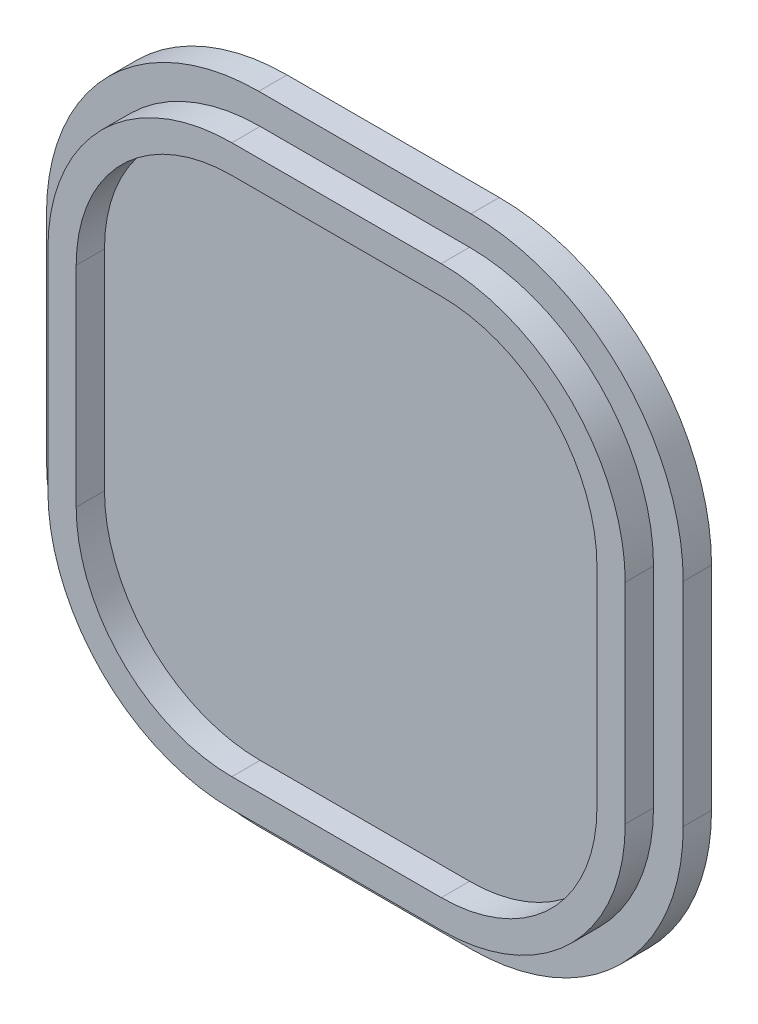
ISO-10303-21;
HEADER;
FILE_DESCRIPTION(('STEP AP214'),'2;1');
FILE_NAME('part.step','',(''),(''),'','','');
FILE_SCHEMA(('AUTOMOTIVE_DESIGN { 1 0 10303 214 1 1 1 1 }'));
ENDSEC;
DATA;
#1=APPLICATION_CONTEXT('core data for automotive mechanical design processes');
#2=APPLICATION_PROTOCOL_DEFINITION('international standard','automotive_design',2000,#1);
#3=PRODUCT_CONTEXT('',#1,'mechanical');
#4=PRODUCT('Part','Part','',(#3));
#5=PRODUCT_RELATED_PRODUCT_CATEGORY('part','',(#4));
#6=PRODUCT_DEFINITION_FORMATION('','',#4);
#7=PRODUCT_DEFINITION_CONTEXT('part definition',#1,'design');
#8=PRODUCT_DEFINITION('design','',#6,#7);
#9=PRODUCT_DEFINITION_SHAPE('','',#8);
#10=(LENGTH_UNIT() NAMED_UNIT(*) SI_UNIT(.MILLI.,.METRE.));
#11=(NAMED_UNIT(*) PLANE_ANGLE_UNIT() SI_UNIT($,.RADIAN.));
#12=(NAMED_UNIT(*) SI_UNIT($,.STERADIAN.) SOLID_ANGLE_UNIT());
#13=UNCERTAINTY_MEASURE_WITH_UNIT(LENGTH_MEASURE(1.E-05),#10,'distance_accuracy_value','');
#14=(GEOMETRIC_REPRESENTATION_CONTEXT(3) GLOBAL_UNCERTAINTY_ASSIGNED_CONTEXT((#13)) GLOBAL_UNIT_ASSIGNED_CONTEXT((#10,
#11,#12)) REPRESENTATION_CONTEXT('',''));
#15=CARTESIAN_POINT('',(0.,0.,0.));
#16=DIRECTION('',(0.,0.,1.));
#17=DIRECTION('',(1.,0.,0.));
#18=AXIS2_PLACEMENT_3D('',#15,#16,#17);
#19=CARTESIAN_POINT('',(0.,0.,2.));
#20=DIRECTION('',(0.,0.,1.));
#21=DIRECTION('',(1.,0.,0.));
#22=AXIS2_PLACEMENT_3D('',#19,#20,#21);
#23=PLANE('',#22);
#24=CARTESIAN_POINT('',(18.7797662481044,3.40317919075145,2.));
#25=DIRECTION('',(0.,0.,1.));
#26=DIRECTION('',(1.,0.,0.));
#27=AXIS2_PLACEMENT_3D('',#24,#25,#26);
#28=CIRCLE('',#27,15.);
#29=CARTESIAN_POINT('',(33.7797662481044,3.40317919075145,2.));
#30=VERTEX_POINT('',#29);
#31=CARTESIAN_POINT('',(18.7797662481044,18.4031791907514,2.));
#32=VERTEX_POINT('',#31);
#33=EDGE_CURVE('E334',#30,#32,#28,.T.);
#34=ORIENTED_EDGE('',*,*,#33,.T.);
#35=DIRECTION('',(-1.,0.,0.));
#36=VECTOR('',#35,1.);
#37=CARTESIAN_POINT('',(-11.2202337518956,18.4031791907514,2.));
#38=LINE('',#37,#36);
#39=CARTESIAN_POINT('',(3.77976624810443,18.4031791907514,2.));
#40=VERTEX_POINT('',#39);
#41=EDGE_CURVE('E303',#32,#40,#38,.T.);
#42=ORIENTED_EDGE('',*,*,#41,.T.);
#43=CARTESIAN_POINT('',(3.77976624810444,3.40317919075145,2.));
#44=DIRECTION('',(0.,0.,1.));
#45=DIRECTION('',(1.,0.,0.));
#46=AXIS2_PLACEMENT_3D('',#43,#44,#45);
#47=CIRCLE('',#46,15.);
#48=CARTESIAN_POINT('',(-11.2202337518956,3.40317919075145,2.));
#49=VERTEX_POINT('',#48);
#50=EDGE_CURVE('E336',#40,#49,#47,.T.);
#51=ORIENTED_EDGE('',*,*,#50,.T.);
#52=DIRECTION('',(0.,-1.,0.));
#53=VECTOR('',#52,1.);
#54=CARTESIAN_POINT('',(-11.2202337518956,18.4031791907514,2.));
#55=LINE('',#54,#53);
#56=CARTESIAN_POINT('',(-11.2202337518956,-11.5968208092485,2.));
#57=VERTEX_POINT('',#56);
#58=EDGE_CURVE('E293',#49,#57,#55,.T.);
#59=ORIENTED_EDGE('',*,*,#58,.T.);
#60=CARTESIAN_POINT('',(3.77976624810444,-11.5968208092486,2.));
#61=DIRECTION('',(0.,0.,1.));
#62=DIRECTION('',(1.,0.,0.));
#63=AXIS2_PLACEMENT_3D('',#60,#61,#62);
#64=CIRCLE('',#63,15.);
#65=CARTESIAN_POINT('',(3.77976624810444,-26.5968208092486,2.));
#66=VERTEX_POINT('',#65);
#67=EDGE_CURVE('E338',#57,#66,#64,.T.);
#68=ORIENTED_EDGE('',*,*,#67,.T.);
#69=DIRECTION('',(1.,0.,0.));
#70=VECTOR('',#69,1.);
#71=CARTESIAN_POINT('',(-11.2202337518956,-26.5968208092486,2.));
#72=LINE('',#71,#70);
#73=CARTESIAN_POINT('',(18.7797662481044,-26.5968208092486,2.));
#74=VERTEX_POINT('',#73);
#75=EDGE_CURVE('E296',#66,#74,#72,.T.);
#76=ORIENTED_EDGE('',*,*,#75,.T.);
#77=CARTESIAN_POINT('',(18.7797662481044,-11.5968208092486,2.));
#78=DIRECTION('',(0.,0.,1.));
#79=DIRECTION('',(1.,0.,0.));
#80=AXIS2_PLACEMENT_3D('',#77,#78,#79);
#81=CIRCLE('',#80,15.);
#82=CARTESIAN_POINT('',(33.7797662481044,-11.5968208092485,2.));
#83=VERTEX_POINT('',#82);
#84=EDGE_CURVE('E340',#74,#83,#81,.T.);
#85=ORIENTED_EDGE('',*,*,#84,.T.);
#86=DIRECTION('',(0.,1.,0.));
#87=VECTOR('',#86,1.);
#88=CARTESIAN_POINT('',(33.7797662481044,18.4031791907514,2.));
#89=LINE('',#88,#87);
#90=EDGE_CURVE('E300',#83,#30,#89,.T.);
#91=ORIENTED_EDGE('',*,*,#90,.T.);
#92=EDGE_LOOP('',(#34,#42,#51,#59,#68,#76,#85,#91));
#93=FACE_BOUND('',#92,.T.);
#94=DIRECTION('',(0.,1.,0.));
#95=VECTOR('',#94,1.);
#96=CARTESIAN_POINT('',(31.6797662481044,16.3031791907514,2.));
#97=LINE('',#96,#95);
#98=CARTESIAN_POINT('',(31.6797662481044,-11.4968208092486,2.));
#99=VERTEX_POINT('',#98);
#100=CARTESIAN_POINT('',(31.6797662481044,3.30317919075144,2.));
#101=VERTEX_POINT('',#100);
#102=EDGE_CURVE('E281',#99,#101,#97,.T.);
#103=ORIENTED_EDGE('',*,*,#102,.F.);
#104=CARTESIAN_POINT('',(18.6797662481044,-11.4968208092486,2.));
#105=DIRECTION('',(0.,0.,1.));
#106=DIRECTION('',(1.,0.,0.));
#107=AXIS2_PLACEMENT_3D('',#104,#105,#106);
#108=CIRCLE('',#107,13.);
#109=CARTESIAN_POINT('',(18.6797662481044,-24.4968208092486,2.));
#110=VERTEX_POINT('',#109);
#111=EDGE_CURVE('E376',#99,#110,#108,.F.);
#112=ORIENTED_EDGE('',*,*,#111,.T.);
#113=DIRECTION('',(1.,0.,0.));
#114=VECTOR('',#113,1.);
#115=CARTESIAN_POINT('',(-9.12023375189556,-24.4968208092486,2.));
#116=LINE('',#115,#114);
#117=CARTESIAN_POINT('',(3.87976624810444,-24.4968208092486,2.));
#118=VERTEX_POINT('',#117);
#119=EDGE_CURVE('E285',#118,#110,#116,.T.);
#120=ORIENTED_EDGE('',*,*,#119,.F.);
#121=CARTESIAN_POINT('',(3.87976624810444,-11.4968208092486,2.));
#122=DIRECTION('',(0.,0.,1.));
#123=DIRECTION('',(1.,0.,0.));
#124=AXIS2_PLACEMENT_3D('',#121,#122,#123);
#125=CIRCLE('',#124,13.);
#126=CARTESIAN_POINT('',(-9.12023375189556,-11.4968208092486,2.));
#127=VERTEX_POINT('',#126);
#128=EDGE_CURVE('E378',#118,#127,#125,.F.);
#129=ORIENTED_EDGE('',*,*,#128,.T.);
#130=DIRECTION('',(0.,-1.,0.));
#131=VECTOR('',#130,1.);
#132=CARTESIAN_POINT('',(-9.12023375189556,16.3031791907514,2.));
#133=LINE('',#132,#131);
#134=CARTESIAN_POINT('',(-9.12023375189556,3.30317919075144,2.));
#135=VERTEX_POINT('',#134);
#136=EDGE_CURVE('E288',#135,#127,#133,.T.);
#137=ORIENTED_EDGE('',*,*,#136,.F.);
#138=CARTESIAN_POINT('',(3.87976624810444,3.30317919075144,2.));
#139=DIRECTION('',(0.,0.,1.));
#140=DIRECTION('',(1.,0.,0.));
#141=AXIS2_PLACEMENT_3D('',#138,#139,#140);
#142=CIRCLE('',#141,13.);
#143=CARTESIAN_POINT('',(3.87976624810444,16.3031791907514,2.));
#144=VERTEX_POINT('',#143);
#145=EDGE_CURVE('E41',#135,#144,#142,.F.);
#146=ORIENTED_EDGE('',*,*,#145,.T.);
#147=DIRECTION('',(-1.,0.,0.));
#148=VECTOR('',#147,1.);
#149=CARTESIAN_POINT('',(-9.12023375189556,16.3031791907514,2.));
#150=LINE('',#149,#148);
#151=CARTESIAN_POINT('',(18.6797662481044,16.3031791907514,2.));
#152=VERTEX_POINT('',#151);
#153=EDGE_CURVE('E286',#152,#144,#150,.T.);
#154=ORIENTED_EDGE('',*,*,#153,.F.);
#155=CARTESIAN_POINT('',(18.6797662481044,3.30317919075144,2.));
#156=DIRECTION('',(0.,0.,1.));
#157=DIRECTION('',(1.,0.,0.));
#158=AXIS2_PLACEMENT_3D('',#155,#156,#157);
#159=CIRCLE('',#158,13.);
#160=EDGE_CURVE('E11',#152,#101,#159,.F.);
#161=ORIENTED_EDGE('',*,*,#160,.T.);
#162=EDGE_LOOP('',(#103,#112,#120,#129,#137,#146,#154,#161));
#163=FACE_BOUND('',#162,.T.);
#164=ADVANCED_FACE('F33',(#93,#163),#23,.T.);
#165=CARTESIAN_POINT('',(-11.2202337518956,18.4031791907514,2.));
#166=DIRECTION('',(1.,0.,0.));
#167=DIRECTION('',(0.,1.,0.));
#168=AXIS2_PLACEMENT_3D('',#165,#166,#167);
#169=PLANE('',#168);
#170=DIRECTION('',(0.,-1.,0.));
#171=VECTOR('',#170,1.);
#172=CARTESIAN_POINT('',(-11.2202337518956,18.4031791907514,0.));
#173=LINE('',#172,#171);
#174=CARTESIAN_POINT('',(-11.2202337518956,3.40317919075145,0.));
#175=VERTEX_POINT('',#174);
#176=CARTESIAN_POINT('',(-11.2202337518956,-11.5968208092485,0.));
#177=VERTEX_POINT('',#176);
#178=EDGE_CURVE('E280',#175,#177,#173,.T.);
#179=ORIENTED_EDGE('',*,*,#178,.T.);
#180=DIRECTION('',(0.,0.,-1.));
#181=VECTOR('',#180,1.);
#182=CARTESIAN_POINT('',(-11.2202337518956,-11.5968208092486,2.));
#183=LINE('',#182,#181);
#184=EDGE_CURVE('E345',#177,#57,#183,.F.);
#185=ORIENTED_EDGE('',*,*,#184,.T.);
#186=ORIENTED_EDGE('',*,*,#58,.F.);
#187=DIRECTION('',(0.,0.,-1.));
#188=VECTOR('',#187,1.);
#189=CARTESIAN_POINT('',(-11.2202337518956,3.40317919075144,2.));
#190=LINE('',#189,#188);
#191=EDGE_CURVE('E342',#49,#175,#190,.T.);
#192=ORIENTED_EDGE('',*,*,#191,.T.);
#193=EDGE_LOOP('',(#179,#185,#186,#192));
#194=FACE_BOUND('',#193,.T.);
#195=ADVANCED_FACE('F414',(#194),#169,.F.);
#196=CARTESIAN_POINT('',(-11.2202337518956,-26.5968208092486,2.));
#197=DIRECTION('',(0.,1.,0.));
#198=DIRECTION('',(0.,0.,1.));
#199=AXIS2_PLACEMENT_3D('',#196,#197,#198);
#200=PLANE('',#199);
#201=DIRECTION('',(1.,0.,0.));
#202=VECTOR('',#201,1.);
#203=CARTESIAN_POINT('',(-11.2202337518956,-26.5968208092486,0.));
#204=LINE('',#203,#202);
#205=CARTESIAN_POINT('',(3.77976624810444,-26.5968208092486,0.));
#206=VERTEX_POINT('',#205);
#207=CARTESIAN_POINT('',(18.7797662481044,-26.5968208092486,0.));
#208=VERTEX_POINT('',#207);
#209=EDGE_CURVE('E309',#206,#208,#204,.T.);
#210=ORIENTED_EDGE('',*,*,#209,.T.);
#211=DIRECTION('',(0.,0.,-1.));
#212=VECTOR('',#211,1.);
#213=CARTESIAN_POINT('',(18.7797662481044,-26.5968208092486,2.));
#214=LINE('',#213,#212);
#215=EDGE_CURVE('E332',#208,#74,#214,.F.);
#216=ORIENTED_EDGE('',*,*,#215,.T.);
#217=ORIENTED_EDGE('',*,*,#75,.F.);
#218=DIRECTION('',(0.,0.,-1.));
#219=VECTOR('',#218,1.);
#220=CARTESIAN_POINT('',(3.77976624810444,-26.5968208092486,2.));
#221=LINE('',#220,#219);
#222=EDGE_CURVE('E329',#66,#206,#221,.T.);
#223=ORIENTED_EDGE('',*,*,#222,.T.);
#224=EDGE_LOOP('',(#210,#216,#217,#223));
#225=FACE_BOUND('',#224,.T.);
#226=ADVANCED_FACE('F420',(#225),#200,.F.);
#227=CARTESIAN_POINT('',(33.7797662481044,18.4031791907514,2.));
#228=DIRECTION('',(-1.,0.,0.));
#229=DIRECTION('',(0.,0.,1.));
#230=AXIS2_PLACEMENT_3D('',#227,#228,#229);
#231=PLANE('',#230);
#232=ORIENTED_EDGE('',*,*,#90,.F.);
#233=DIRECTION('',(0.,0.,-1.));
#234=VECTOR('',#233,1.);
#235=CARTESIAN_POINT('',(33.7797662481044,-11.5968208092486,2.));
#236=LINE('',#235,#234);
#237=CARTESIAN_POINT('',(33.7797662481044,-11.5968208092485,0.));
#238=VERTEX_POINT('',#237);
#239=EDGE_CURVE('E318',#83,#238,#236,.T.);
#240=ORIENTED_EDGE('',*,*,#239,.T.);
#241=DIRECTION('',(0.,1.,0.));
#242=VECTOR('',#241,1.);
#243=CARTESIAN_POINT('',(33.7797662481044,18.4031791907514,0.));
#244=LINE('',#243,#242);
#245=CARTESIAN_POINT('',(33.7797662481044,3.40317919075145,0.));
#246=VERTEX_POINT('',#245);
#247=EDGE_CURVE('E312',#238,#246,#244,.T.);
#248=ORIENTED_EDGE('',*,*,#247,.T.);
#249=DIRECTION('',(0.,0.,-1.));
#250=VECTOR('',#249,1.);
#251=CARTESIAN_POINT('',(33.7797662481044,3.40317919075145,2.));
#252=LINE('',#251,#250);
#253=EDGE_CURVE('E306',#246,#30,#252,.F.);
#254=ORIENTED_EDGE('',*,*,#253,.T.);
#255=EDGE_LOOP('',(#232,#240,#248,#254));
#256=FACE_BOUND('',#255,.T.);
#257=ADVANCED_FACE('F434',(#256),#231,.F.);
#258=CARTESIAN_POINT('',(-11.2202337518956,18.4031791907514,2.));
#259=DIRECTION('',(0.,-1.,0.));
#260=DIRECTION('',(0.,0.,-1.));
#261=AXIS2_PLACEMENT_3D('',#258,#259,#260);
#262=PLANE('',#261);
#263=DIRECTION('',(-1.,0.,0.));
#264=VECTOR('',#263,1.);
#265=CARTESIAN_POINT('',(-11.2202337518956,18.4031791907514,0.));
#266=LINE('',#265,#264);
#267=CARTESIAN_POINT('',(18.7797662481044,18.4031791907514,0.));
#268=VERTEX_POINT('',#267);
#269=CARTESIAN_POINT('',(3.77976624810443,18.4031791907514,0.));
#270=VERTEX_POINT('',#269);
#271=EDGE_CURVE('E297',#268,#270,#266,.T.);
#272=ORIENTED_EDGE('',*,*,#271,.T.);
#273=DIRECTION('',(0.,0.,-1.));
#274=VECTOR('',#273,1.);
#275=CARTESIAN_POINT('',(3.77976624810444,18.4031791907514,2.));
#276=LINE('',#275,#274);
#277=EDGE_CURVE('E289',#270,#40,#276,.F.);
#278=ORIENTED_EDGE('',*,*,#277,.T.);
#279=ORIENTED_EDGE('',*,*,#41,.F.);
#280=DIRECTION('',(0.,0.,-1.));
#281=VECTOR('',#280,1.);
#282=CARTESIAN_POINT('',(18.7797662481044,18.4031791907514,2.));
#283=LINE('',#282,#281);
#284=EDGE_CURVE('E347',#32,#268,#283,.T.);
#285=ORIENTED_EDGE('',*,*,#284,.T.);
#286=EDGE_LOOP('',(#272,#278,#279,#285));
#287=FACE_BOUND('',#286,.T.);
#288=ADVANCED_FACE('F430',(#287),#262,.F.);
#289=CARTESIAN_POINT('',(0.,0.,0.));
#290=DIRECTION('',(0.,0.,1.));
#291=DIRECTION('',(1.,0.,0.));
#292=AXIS2_PLACEMENT_3D('',#289,#290,#291);
#293=PLANE('',#292);
#294=ORIENTED_EDGE('',*,*,#247,.F.);
#295=CARTESIAN_POINT('',(18.7797662481044,-11.5968208092486,0.));
#296=DIRECTION('',(0.,0.,1.));
#297=DIRECTION('',(1.,0.,0.));
#298=AXIS2_PLACEMENT_3D('',#295,#296,#297);
#299=CIRCLE('',#298,15.);
#300=EDGE_CURVE('E327',#238,#208,#299,.F.);
#301=ORIENTED_EDGE('',*,*,#300,.T.);
#302=ORIENTED_EDGE('',*,*,#209,.F.);
#303=CARTESIAN_POINT('',(3.77976624810444,-11.5968208092486,0.));
#304=DIRECTION('',(0.,0.,1.));
#305=DIRECTION('',(1.,0.,0.));
#306=AXIS2_PLACEMENT_3D('',#303,#304,#305);
#307=CIRCLE('',#306,15.);
#308=EDGE_CURVE('E325',#206,#177,#307,.F.);
#309=ORIENTED_EDGE('',*,*,#308,.T.);
#310=ORIENTED_EDGE('',*,*,#178,.F.);
#311=CARTESIAN_POINT('',(3.77976624810444,3.40317919075145,0.));
#312=DIRECTION('',(0.,0.,1.));
#313=DIRECTION('',(1.,0.,0.));
#314=AXIS2_PLACEMENT_3D('',#311,#312,#313);
#315=CIRCLE('',#314,15.);
#316=EDGE_CURVE('E323',#175,#270,#315,.F.);
#317=ORIENTED_EDGE('',*,*,#316,.T.);
#318=ORIENTED_EDGE('',*,*,#271,.F.);
#319=CARTESIAN_POINT('',(18.7797662481044,3.40317919075145,0.));
#320=DIRECTION('',(0.,0.,1.));
#321=DIRECTION('',(1.,0.,0.));
#322=AXIS2_PLACEMENT_3D('',#319,#320,#321);
#323=CIRCLE('',#322,15.);
#324=EDGE_CURVE('E321',#268,#246,#323,.F.);
#325=ORIENTED_EDGE('',*,*,#324,.T.);
#326=EDGE_LOOP('',(#294,#301,#302,#309,#310,#317,#318,#325));
#327=FACE_BOUND('',#326,.T.);
#328=ADVANCED_FACE('F426',(#327),#293,.F.);
#329=CARTESIAN_POINT('',(18.7797662481044,-11.5968208092486,2.));
#330=DIRECTION('',(0.,0.,-1.));
#331=DIRECTION('',(-1.,0.,0.));
#332=AXIS2_PLACEMENT_3D('',#329,#330,#331);
#333=CYLINDRICAL_SURFACE('',#332,15.);
#334=ORIENTED_EDGE('',*,*,#84,.F.);
#335=ORIENTED_EDGE('',*,*,#215,.F.);
#336=ORIENTED_EDGE('',*,*,#300,.F.);
#337=ORIENTED_EDGE('',*,*,#239,.F.);
#338=EDGE_LOOP('',(#334,#335,#336,#337));
#339=FACE_BOUND('',#338,.T.);
#340=ADVANCED_FACE('F429',(#339),#333,.T.);
#341=CARTESIAN_POINT('',(3.77976624810444,-11.5968208092486,2.));
#342=DIRECTION('',(0.,0.,-1.));
#343=DIRECTION('',(-1.,0.,0.));
#344=AXIS2_PLACEMENT_3D('',#341,#342,#343);
#345=CYLINDRICAL_SURFACE('',#344,15.);
#346=ORIENTED_EDGE('',*,*,#67,.F.);
#347=ORIENTED_EDGE('',*,*,#184,.F.);
#348=ORIENTED_EDGE('',*,*,#308,.F.);
#349=ORIENTED_EDGE('',*,*,#222,.F.);
#350=EDGE_LOOP('',(#346,#347,#348,#349));
#351=FACE_BOUND('',#350,.T.);
#352=ADVANCED_FACE('F444',(#351),#345,.T.);
#353=CARTESIAN_POINT('',(3.77976624810444,3.40317919075145,2.));
#354=DIRECTION('',(0.,0.,-1.));
#355=DIRECTION('',(-1.,0.,0.));
#356=AXIS2_PLACEMENT_3D('',#353,#354,#355);
#357=CYLINDRICAL_SURFACE('',#356,15.);
#358=ORIENTED_EDGE('',*,*,#50,.F.);
#359=ORIENTED_EDGE('',*,*,#277,.F.);
#360=ORIENTED_EDGE('',*,*,#316,.F.);
#361=ORIENTED_EDGE('',*,*,#191,.F.);
#362=EDGE_LOOP('',(#358,#359,#360,#361));
#363=FACE_BOUND('',#362,.T.);
#364=ADVANCED_FACE('F448',(#363),#357,.T.);
#365=CARTESIAN_POINT('',(18.7797662481044,3.40317919075145,2.));
#366=DIRECTION('',(0.,0.,-1.));
#367=DIRECTION('',(-1.,0.,0.));
#368=AXIS2_PLACEMENT_3D('',#365,#366,#367);
#369=CYLINDRICAL_SURFACE('',#368,15.);
#370=ORIENTED_EDGE('',*,*,#33,.F.);
#371=ORIENTED_EDGE('',*,*,#253,.F.);
#372=ORIENTED_EDGE('',*,*,#324,.F.);
#373=ORIENTED_EDGE('',*,*,#284,.F.);
#374=EDGE_LOOP('',(#370,#371,#372,#373));
#375=FACE_BOUND('',#374,.T.);
#376=ADVANCED_FACE('F452',(#375),#369,.T.);
#377=CARTESIAN_POINT('',(31.6797662481044,16.3031791907514,4.));
#378=DIRECTION('',(-1.,0.,0.));
#379=DIRECTION('',(0.,0.,1.));
#380=AXIS2_PLACEMENT_3D('',#377,#378,#379);
#381=PLANE('',#380);
#382=DIRECTION('',(0.,1.,0.));
#383=VECTOR('',#382,1.);
#384=CARTESIAN_POINT('',(31.6797662481044,16.3031791907514,4.));
#385=LINE('',#384,#383);
#386=CARTESIAN_POINT('',(31.6797662481044,-11.4968208092486,4.));
#387=VERTEX_POINT('',#386);
#388=CARTESIAN_POINT('',(31.6797662481044,3.30317919075144,4.));
#389=VERTEX_POINT('',#388);
#390=EDGE_CURVE('E269',#387,#389,#385,.T.);
#391=ORIENTED_EDGE('',*,*,#390,.F.);
#392=DIRECTION('',(0.,0.,-1.));
#393=VECTOR('',#392,1.);
#394=CARTESIAN_POINT('',(31.6797662481044,-11.4968208092486,4.));
#395=LINE('',#394,#393);
#396=EDGE_CURVE('E352',#387,#99,#395,.T.);
#397=ORIENTED_EDGE('',*,*,#396,.T.);
#398=ORIENTED_EDGE('',*,*,#102,.T.);
#399=DIRECTION('',(0.,0.,-1.));
#400=VECTOR('',#399,1.);
#401=CARTESIAN_POINT('',(31.6797662481044,3.30317919075144,4.));
#402=LINE('',#401,#400);
#403=EDGE_CURVE('E284',#101,#389,#402,.F.);
#404=ORIENTED_EDGE('',*,*,#403,.T.);
#405=EDGE_LOOP('',(#391,#397,#398,#404));
#406=FACE_BOUND('',#405,.T.);
#407=ADVANCED_FACE('F397',(#406),#381,.F.);
#408=CARTESIAN_POINT('',(-9.12023375189556,16.3031791907514,4.));
#409=DIRECTION('',(0.,-1.,0.));
#410=DIRECTION('',(0.,0.,-1.));
#411=AXIS2_PLACEMENT_3D('',#408,#409,#410);
#412=PLANE('',#411);
#413=ORIENTED_EDGE('',*,*,#153,.T.);
#414=DIRECTION('',(0.,0.,-1.));
#415=VECTOR('',#414,1.);
#416=CARTESIAN_POINT('',(3.87976624810444,16.3031791907514,4.));
#417=LINE('',#416,#415);
#418=CARTESIAN_POINT('',(3.87976624810444,16.3031791907514,4.));
#419=VERTEX_POINT('',#418);
#420=EDGE_CURVE('E374',#144,#419,#417,.F.);
#421=ORIENTED_EDGE('',*,*,#420,.T.);
#422=DIRECTION('',(-1.,0.,0.));
#423=VECTOR('',#422,1.);
#424=CARTESIAN_POINT('',(-9.12023375189556,16.3031791907514,4.));
#425=LINE('',#424,#423);
#426=CARTESIAN_POINT('',(18.6797662481044,16.3031791907514,4.));
#427=VERTEX_POINT('',#426);
#428=EDGE_CURVE('E272',#427,#419,#425,.T.);
#429=ORIENTED_EDGE('',*,*,#428,.F.);
#430=DIRECTION('',(0.,0.,-1.));
#431=VECTOR('',#430,1.);
#432=CARTESIAN_POINT('',(18.6797662481044,16.3031791907514,4.));
#433=LINE('',#432,#431);
#434=EDGE_CURVE('E371',#427,#152,#433,.T.);
#435=ORIENTED_EDGE('',*,*,#434,.T.);
#436=EDGE_LOOP('',(#413,#421,#429,#435));
#437=FACE_BOUND('',#436,.T.);
#438=ADVANCED_FACE('F404',(#437),#412,.F.);
#439=CARTESIAN_POINT('',(-9.12023375189556,16.3031791907514,4.));
#440=DIRECTION('',(1.,0.,0.));
#441=DIRECTION('',(0.,1.,0.));
#442=AXIS2_PLACEMENT_3D('',#439,#440,#441);
#443=PLANE('',#442);
#444=ORIENTED_EDGE('',*,*,#136,.T.);
#445=DIRECTION('',(0.,0.,-1.));
#446=VECTOR('',#445,1.);
#447=CARTESIAN_POINT('',(-9.12023375189556,-11.4968208092486,4.));
#448=LINE('',#447,#446);
#449=CARTESIAN_POINT('',(-9.12023375189556,-11.4968208092486,4.));
#450=VERTEX_POINT('',#449);
#451=EDGE_CURVE('E86',#127,#450,#448,.F.);
#452=ORIENTED_EDGE('',*,*,#451,.T.);
#453=DIRECTION('',(0.,-1.,0.));
#454=VECTOR('',#453,1.);
#455=CARTESIAN_POINT('',(-9.12023375189556,16.3031791907514,4.));
#456=LINE('',#455,#454);
#457=CARTESIAN_POINT('',(-9.12023375189556,3.30317919075144,4.));
#458=VERTEX_POINT('',#457);
#459=EDGE_CURVE('E275',#458,#450,#456,.T.);
#460=ORIENTED_EDGE('',*,*,#459,.F.);
#461=DIRECTION('',(0.,0.,-1.));
#462=VECTOR('',#461,1.);
#463=CARTESIAN_POINT('',(-9.12023375189556,3.30317919075144,4.));
#464=LINE('',#463,#462);
#465=EDGE_CURVE('E368',#458,#135,#464,.T.);
#466=ORIENTED_EDGE('',*,*,#465,.T.);
#467=EDGE_LOOP('',(#444,#452,#460,#466));
#468=FACE_BOUND('',#467,.T.);
#469=ADVANCED_FACE('F383',(#468),#443,.F.);
#470=CARTESIAN_POINT('',(-9.12023375189556,-24.4968208092486,4.));
#471=DIRECTION('',(0.,1.,0.));
#472=DIRECTION('',(0.,0.,1.));
#473=AXIS2_PLACEMENT_3D('',#470,#471,#472);
#474=PLANE('',#473);
#475=ORIENTED_EDGE('',*,*,#119,.T.);
#476=DIRECTION('',(0.,0.,-1.));
#477=VECTOR('',#476,1.);
#478=CARTESIAN_POINT('',(18.6797662481044,-24.4968208092486,4.));
#479=LINE('',#478,#477);
#480=CARTESIAN_POINT('',(18.6797662481044,-24.4968208092486,4.));
#481=VERTEX_POINT('',#480);
#482=EDGE_CURVE('E358',#110,#481,#479,.F.);
#483=ORIENTED_EDGE('',*,*,#482,.T.);
#484=DIRECTION('',(1.,0.,0.));
#485=VECTOR('',#484,1.);
#486=CARTESIAN_POINT('',(-9.12023375189556,-24.4968208092486,4.));
#487=LINE('',#486,#485);
#488=CARTESIAN_POINT('',(3.87976624810444,-24.4968208092486,4.));
#489=VERTEX_POINT('',#488);
#490=EDGE_CURVE('E277',#489,#481,#487,.T.);
#491=ORIENTED_EDGE('',*,*,#490,.F.);
#492=DIRECTION('',(0.,0.,-1.));
#493=VECTOR('',#492,1.);
#494=CARTESIAN_POINT('',(3.87976624810444,-24.4968208092486,4.));
#495=LINE('',#494,#493);
#496=EDGE_CURVE('E355',#489,#118,#495,.T.);
#497=ORIENTED_EDGE('',*,*,#496,.T.);
#498=EDGE_LOOP('',(#475,#483,#491,#497));
#499=FACE_BOUND('',#498,.T.);
#500=ADVANCED_FACE('F389',(#499),#474,.F.);
#501=CARTESIAN_POINT('',(0.,0.,4.));
#502=DIRECTION('',(0.,0.,1.));
#503=DIRECTION('',(1.,0.,0.));
#504=AXIS2_PLACEMENT_3D('',#501,#502,#503);
#505=PLANE('',#504);
#506=DIRECTION('',(1.,0.,0.));
#507=VECTOR('',#506,1.);
#508=CARTESIAN_POINT('',(-9.12023375189556,-22.4968208092486,4.));
#509=LINE('',#508,#507);
#510=CARTESIAN_POINT('',(3.87976624810444,-22.4968208092486,4.));
#511=VERTEX_POINT('',#510);
#512=CARTESIAN_POINT('',(18.6797662481044,-22.4968208092486,4.));
#513=VERTEX_POINT('',#512);
#514=EDGE_CURVE('E217',#511,#513,#509,.T.);
#515=ORIENTED_EDGE('',*,*,#514,.F.);
#516=CARTESIAN_POINT('',(3.87976624810444,-11.4968208092486,4.));
#517=DIRECTION('',(0.,0.,1.));
#518=DIRECTION('',(1.,0.,0.));
#519=AXIS2_PLACEMENT_3D('',#516,#517,#518);
#520=CIRCLE('',#519,11.);
#521=CARTESIAN_POINT('',(-7.12023375189556,-11.4968208092486,4.));
#522=VERTEX_POINT('',#521);
#523=EDGE_CURVE('E237',#522,#511,#520,.T.);
#524=ORIENTED_EDGE('',*,*,#523,.F.);
#525=DIRECTION('',(0.,-1.,0.));
#526=VECTOR('',#525,1.);
#527=CARTESIAN_POINT('',(-7.12023375189556,16.3031791907514,4.));
#528=LINE('',#527,#526);
#529=CARTESIAN_POINT('',(-7.12023375189556,3.30317919075144,4.));
#530=VERTEX_POINT('',#529);
#531=EDGE_CURVE('E48',#530,#522,#528,.T.);
#532=ORIENTED_EDGE('',*,*,#531,.F.);
#533=CARTESIAN_POINT('',(3.87976624810444,3.30317919075144,4.));
#534=DIRECTION('',(0.,0.,1.));
#535=DIRECTION('',(1.,0.,0.));
#536=AXIS2_PLACEMENT_3D('',#533,#534,#535);
#537=CIRCLE('',#536,11.);
#538=CARTESIAN_POINT('',(3.87976624810444,14.3031791907514,4.));
#539=VERTEX_POINT('',#538);
#540=EDGE_CURVE('E234',#539,#530,#537,.T.);
#541=ORIENTED_EDGE('',*,*,#540,.F.);
#542=DIRECTION('',(-1.,0.,0.));
#543=VECTOR('',#542,1.);
#544=CARTESIAN_POINT('',(-9.12023375189556,14.3031791907514,4.));
#545=LINE('',#544,#543);
#546=CARTESIAN_POINT('',(18.6797662481044,14.3031791907514,4.));
#547=VERTEX_POINT('',#546);
#548=EDGE_CURVE('E226',#547,#539,#545,.T.);
#549=ORIENTED_EDGE('',*,*,#548,.F.);
#550=CARTESIAN_POINT('',(18.6797662481044,3.30317919075144,4.));
#551=DIRECTION('',(0.,0.,1.));
#552=DIRECTION('',(1.,0.,0.));
#553=AXIS2_PLACEMENT_3D('',#550,#551,#552);
#554=CIRCLE('',#553,11.);
#555=CARTESIAN_POINT('',(29.6797662481044,3.30317919075144,4.));
#556=VERTEX_POINT('',#555);
#557=EDGE_CURVE('E209',#556,#547,#554,.T.);
#558=ORIENTED_EDGE('',*,*,#557,.F.);
#559=DIRECTION('',(0.,1.,0.));
#560=VECTOR('',#559,1.);
#561=CARTESIAN_POINT('',(29.6797662481044,16.3031791907514,4.));
#562=LINE('',#561,#560);
#563=CARTESIAN_POINT('',(29.6797662481044,-11.4968208092486,4.));
#564=VERTEX_POINT('',#563);
#565=EDGE_CURVE('E221',#564,#556,#562,.T.);
#566=ORIENTED_EDGE('',*,*,#565,.F.);
#567=CARTESIAN_POINT('',(18.6797662481044,-11.4968208092486,4.));
#568=DIRECTION('',(0.,0.,1.));
#569=DIRECTION('',(1.,0.,0.));
#570=AXIS2_PLACEMENT_3D('',#567,#568,#569);
#571=CIRCLE('',#570,11.);
#572=EDGE_CURVE('E246',#513,#564,#571,.T.);
#573=ORIENTED_EDGE('',*,*,#572,.F.);
#574=EDGE_LOOP('',(#515,#524,#532,#541,#549,#558,#566,#573));
#575=FACE_BOUND('',#574,.T.);
#576=ORIENTED_EDGE('',*,*,#490,.T.);
#577=CARTESIAN_POINT('',(18.6797662481044,-11.4968208092486,4.));
#578=DIRECTION('',(0.,0.,1.));
#579=DIRECTION('',(1.,0.,0.));
#580=AXIS2_PLACEMENT_3D('',#577,#578,#579);
#581=CIRCLE('',#580,13.);
#582=EDGE_CURVE('E366',#481,#387,#581,.T.);
#583=ORIENTED_EDGE('',*,*,#582,.T.);
#584=ORIENTED_EDGE('',*,*,#390,.T.);
#585=CARTESIAN_POINT('',(18.6797662481044,3.30317919075144,4.));
#586=DIRECTION('',(0.,0.,1.));
#587=DIRECTION('',(1.,0.,0.));
#588=AXIS2_PLACEMENT_3D('',#585,#586,#587);
#589=CIRCLE('',#588,13.);
#590=EDGE_CURVE('E360',#389,#427,#589,.T.);
#591=ORIENTED_EDGE('',*,*,#590,.T.);
#592=ORIENTED_EDGE('',*,*,#428,.T.);
#593=CARTESIAN_POINT('',(3.87976624810444,3.30317919075144,4.));
#594=DIRECTION('',(0.,0.,1.));
#595=DIRECTION('',(1.,0.,0.));
#596=AXIS2_PLACEMENT_3D('',#593,#594,#595);
#597=CIRCLE('',#596,13.);
#598=EDGE_CURVE('E362',#419,#458,#597,.T.);
#599=ORIENTED_EDGE('',*,*,#598,.T.);
#600=ORIENTED_EDGE('',*,*,#459,.T.);
#601=CARTESIAN_POINT('',(3.87976624810444,-11.4968208092486,4.));
#602=DIRECTION('',(0.,0.,1.));
#603=DIRECTION('',(1.,0.,0.));
#604=AXIS2_PLACEMENT_3D('',#601,#602,#603);
#605=CIRCLE('',#604,13.);
#606=EDGE_CURVE('E364',#450,#489,#605,.T.);
#607=ORIENTED_EDGE('',*,*,#606,.T.);
#608=EDGE_LOOP('',(#576,#583,#584,#591,#592,#599,#600,#607));
#609=FACE_BOUND('',#608,.T.);
#610=ADVANCED_FACE('F230',(#575,#609),#505,.T.);
#611=CARTESIAN_POINT('',(18.6797662481044,-11.4968208092486,4.));
#612=DIRECTION('',(0.,0.,-1.));
#613=DIRECTION('',(-1.,0.,0.));
#614=AXIS2_PLACEMENT_3D('',#611,#612,#613);
#615=CYLINDRICAL_SURFACE('',#614,13.);
#616=ORIENTED_EDGE('',*,*,#582,.F.);
#617=ORIENTED_EDGE('',*,*,#482,.F.);
#618=ORIENTED_EDGE('',*,*,#111,.F.);
#619=ORIENTED_EDGE('',*,*,#396,.F.);
#620=EDGE_LOOP('',(#616,#617,#618,#619));
#621=FACE_BOUND('',#620,.T.);
#622=ADVANCED_FACE('F392',(#621),#615,.T.);
#623=CARTESIAN_POINT('',(3.87976624810444,-11.4968208092486,4.));
#624=DIRECTION('',(0.,0.,-1.));
#625=DIRECTION('',(-1.,0.,0.));
#626=AXIS2_PLACEMENT_3D('',#623,#624,#625);
#627=CYLINDRICAL_SURFACE('',#626,13.);
#628=ORIENTED_EDGE('',*,*,#606,.F.);
#629=ORIENTED_EDGE('',*,*,#451,.F.);
#630=ORIENTED_EDGE('',*,*,#128,.F.);
#631=ORIENTED_EDGE('',*,*,#496,.F.);
#632=EDGE_LOOP('',(#628,#629,#630,#631));
#633=FACE_BOUND('',#632,.T.);
#634=ADVANCED_FACE('F385',(#633),#627,.T.);
#635=CARTESIAN_POINT('',(3.87976624810444,3.30317919075144,4.));
#636=DIRECTION('',(0.,0.,-1.));
#637=DIRECTION('',(-1.,0.,0.));
#638=AXIS2_PLACEMENT_3D('',#635,#636,#637);
#639=CYLINDRICAL_SURFACE('',#638,13.);
#640=ORIENTED_EDGE('',*,*,#598,.F.);
#641=ORIENTED_EDGE('',*,*,#420,.F.);
#642=ORIENTED_EDGE('',*,*,#145,.F.);
#643=ORIENTED_EDGE('',*,*,#465,.F.);
#644=EDGE_LOOP('',(#640,#641,#642,#643));
#645=FACE_BOUND('',#644,.T.);
#646=ADVANCED_FACE('F405',(#645),#639,.T.);
#647=CARTESIAN_POINT('',(18.6797662481044,3.30317919075144,4.));
#648=DIRECTION('',(0.,0.,-1.));
#649=DIRECTION('',(-1.,0.,0.));
#650=AXIS2_PLACEMENT_3D('',#647,#648,#649);
#651=CYLINDRICAL_SURFACE('',#650,13.);
#652=ORIENTED_EDGE('',*,*,#590,.F.);
#653=ORIENTED_EDGE('',*,*,#403,.F.);
#654=ORIENTED_EDGE('',*,*,#160,.F.);
#655=ORIENTED_EDGE('',*,*,#434,.F.);
#656=EDGE_LOOP('',(#652,#653,#654,#655));
#657=FACE_BOUND('',#656,.T.);
#658=ADVANCED_FACE('F35',(#657),#651,.T.);
#659=CARTESIAN_POINT('',(0.,0.,2.));
#660=DIRECTION('',(0.,0.,1.));
#661=DIRECTION('',(1.,0.,0.));
#662=AXIS2_PLACEMENT_3D('',#659,#660,#661);
#663=PLANE('',#662);
#664=CARTESIAN_POINT('',(18.6797662481044,3.30317919075144,2.));
#665=DIRECTION('',(0.,0.,1.));
#666=DIRECTION('',(1.,0.,0.));
#667=AXIS2_PLACEMENT_3D('',#664,#665,#666);
#668=CIRCLE('',#667,11.);
#669=CARTESIAN_POINT('',(29.6797662481044,3.30317919075144,2.));
#670=VERTEX_POINT('',#669);
#671=CARTESIAN_POINT('',(18.6797662481044,14.3031791907514,2.));
#672=VERTEX_POINT('',#671);
#673=EDGE_CURVE('E212',#670,#672,#668,.T.);
#674=ORIENTED_EDGE('',*,*,#673,.T.);
#675=DIRECTION('',(1.,0.,0.));
#676=VECTOR('',#675,1.);
#677=CARTESIAN_POINT('',(0.,14.3031791907514,2.));
#678=LINE('',#677,#676);
#679=CARTESIAN_POINT('',(3.87976624810444,14.3031791907514,2.));
#680=VERTEX_POINT('',#679);
#681=EDGE_CURVE('E266',#680,#672,#678,.T.);
#682=ORIENTED_EDGE('',*,*,#681,.F.);
#683=CARTESIAN_POINT('',(3.87976624810444,3.30317919075144,2.));
#684=DIRECTION('',(0.,0.,1.));
#685=DIRECTION('',(1.,0.,0.));
#686=AXIS2_PLACEMENT_3D('',#683,#684,#685);
#687=CIRCLE('',#686,11.);
#688=CARTESIAN_POINT('',(-7.12023375189556,3.30317919075144,2.));
#689=VERTEX_POINT('',#688);
#690=EDGE_CURVE('E263',#680,#689,#687,.T.);
#691=ORIENTED_EDGE('',*,*,#690,.T.);
#692=DIRECTION('',(0.,1.,0.));
#693=VECTOR('',#692,1.);
#694=CARTESIAN_POINT('',(-7.12023375189556,0.,2.));
#695=LINE('',#694,#693);
#696=CARTESIAN_POINT('',(-7.12023375189556,-11.4968208092486,2.));
#697=VERTEX_POINT('',#696);
#698=EDGE_CURVE('E261',#697,#689,#695,.T.);
#699=ORIENTED_EDGE('',*,*,#698,.F.);
#700=CARTESIAN_POINT('',(3.87976624810444,-11.4968208092486,2.));
#701=DIRECTION('',(0.,0.,1.));
#702=DIRECTION('',(1.,0.,0.));
#703=AXIS2_PLACEMENT_3D('',#700,#701,#702);
#704=CIRCLE('',#703,11.);
#705=CARTESIAN_POINT('',(3.87976624810444,-22.4968208092486,2.));
#706=VERTEX_POINT('',#705);
#707=EDGE_CURVE('E258',#697,#706,#704,.T.);
#708=ORIENTED_EDGE('',*,*,#707,.T.);
#709=DIRECTION('',(-1.,0.,0.));
#710=VECTOR('',#709,1.);
#711=CARTESIAN_POINT('',(0.,-22.4968208092486,2.));
#712=LINE('',#711,#710);
#713=CARTESIAN_POINT('',(18.6797662481044,-22.4968208092486,2.));
#714=VERTEX_POINT('',#713);
#715=EDGE_CURVE('E256',#714,#706,#712,.T.);
#716=ORIENTED_EDGE('',*,*,#715,.F.);
#717=CARTESIAN_POINT('',(18.6797662481044,-11.4968208092486,2.));
#718=DIRECTION('',(0.,0.,1.));
#719=DIRECTION('',(1.,0.,0.));
#720=AXIS2_PLACEMENT_3D('',#717,#718,#719);
#721=CIRCLE('',#720,11.);
#722=CARTESIAN_POINT('',(29.6797662481044,-11.4968208092486,2.));
#723=VERTEX_POINT('',#722);
#724=EDGE_CURVE('E253',#714,#723,#721,.T.);
#725=ORIENTED_EDGE('',*,*,#724,.T.);
#726=DIRECTION('',(0.,-1.,0.));
#727=VECTOR('',#726,1.);
#728=CARTESIAN_POINT('',(29.6797662481044,0.,2.));
#729=LINE('',#728,#727);
#730=EDGE_CURVE('E251',#670,#723,#729,.T.);
#731=ORIENTED_EDGE('',*,*,#730,.F.);
#732=EDGE_LOOP('',(#674,#682,#691,#699,#708,#716,#725,#731));
#733=FACE_BOUND('',#732,.T.);
#734=ADVANCED_FACE('F411',(#733),#663,.T.);
#735=CARTESIAN_POINT('',(29.6797662481044,16.3031791907514,4.));
#736=DIRECTION('',(-1.,0.,0.));
#737=DIRECTION('',(0.,0.,1.));
#738=AXIS2_PLACEMENT_3D('',#735,#736,#737);
#739=PLANE('',#738);
#740=ORIENTED_EDGE('',*,*,#730,.T.);
#741=DIRECTION('',(0.,0.,1.));
#742=VECTOR('',#741,1.);
#743=CARTESIAN_POINT('',(29.6797662481044,-11.4968208092486,4.));
#744=LINE('',#743,#742);
#745=EDGE_CURVE('E216',#564,#723,#744,.F.);
#746=ORIENTED_EDGE('',*,*,#745,.F.);
#747=ORIENTED_EDGE('',*,*,#565,.T.);
#748=DIRECTION('',(0.,0.,1.));
#749=VECTOR('',#748,1.);
#750=CARTESIAN_POINT('',(29.6797662481044,3.30317919075144,4.));
#751=LINE('',#750,#749);
#752=EDGE_CURVE('E204',#670,#556,#751,.T.);
#753=ORIENTED_EDGE('',*,*,#752,.F.);
#754=EDGE_LOOP('',(#740,#746,#747,#753));
#755=FACE_BOUND('',#754,.T.);
#756=ADVANCED_FACE('F222',(#755),#739,.T.);
#757=CARTESIAN_POINT('',(-9.12023375189556,14.3031791907514,4.));
#758=DIRECTION('',(0.,-1.,0.));
#759=DIRECTION('',(0.,0.,-1.));
#760=AXIS2_PLACEMENT_3D('',#757,#758,#759);
#761=PLANE('',#760);
#762=ORIENTED_EDGE('',*,*,#681,.T.);
#763=DIRECTION('',(0.,0.,-1.));
#764=VECTOR('',#763,1.);
#765=CARTESIAN_POINT('',(18.6797662481044,14.3031791907514,4.));
#766=LINE('',#765,#764);
#767=EDGE_CURVE('E660',#547,#672,#766,.T.);
#768=ORIENTED_EDGE('',*,*,#767,.F.);
#769=ORIENTED_EDGE('',*,*,#548,.T.);
#770=DIRECTION('',(0.,0.,-1.));
#771=VECTOR('',#770,1.);
#772=CARTESIAN_POINT('',(3.87976624810444,14.3031791907514,4.));
#773=LINE('',#772,#771);
#774=EDGE_CURVE('E254',#680,#539,#773,.F.);
#775=ORIENTED_EDGE('',*,*,#774,.F.);
#776=EDGE_LOOP('',(#762,#768,#769,#775));
#777=FACE_BOUND('',#776,.T.);
#778=ADVANCED_FACE('F588',(#777),#761,.T.);
#779=CARTESIAN_POINT('',(-7.12023375189556,16.3031791907514,4.));
#780=DIRECTION('',(1.,0.,0.));
#781=DIRECTION('',(0.,1.,0.));
#782=AXIS2_PLACEMENT_3D('',#779,#780,#781);
#783=PLANE('',#782);
#784=ORIENTED_EDGE('',*,*,#698,.T.);
#785=DIRECTION('',(0.,0.,1.));
#786=VECTOR('',#785,1.);
#787=CARTESIAN_POINT('',(-7.12023375189556,3.30317919075144,4.));
#788=LINE('',#787,#786);
#789=EDGE_CURVE('E250',#530,#689,#788,.F.);
#790=ORIENTED_EDGE('',*,*,#789,.F.);
#791=ORIENTED_EDGE('',*,*,#531,.T.);
#792=DIRECTION('',(0.,0.,1.));
#793=VECTOR('',#792,1.);
#794=CARTESIAN_POINT('',(-7.12023375189556,-11.4968208092486,4.));
#795=LINE('',#794,#793);
#796=EDGE_CURVE('E665',#697,#522,#795,.T.);
#797=ORIENTED_EDGE('',*,*,#796,.F.);
#798=EDGE_LOOP('',(#784,#790,#791,#797));
#799=FACE_BOUND('',#798,.T.);
#800=ADVANCED_FACE('F596',(#799),#783,.T.);
#801=CARTESIAN_POINT('',(-9.12023375189556,-22.4968208092486,4.));
#802=DIRECTION('',(0.,1.,0.));
#803=DIRECTION('',(0.,0.,1.));
#804=AXIS2_PLACEMENT_3D('',#801,#802,#803);
#805=PLANE('',#804);
#806=ORIENTED_EDGE('',*,*,#715,.T.);
#807=DIRECTION('',(0.,0.,1.));
#808=VECTOR('',#807,1.);
#809=CARTESIAN_POINT('',(3.87976624810444,-22.4968208092486,4.));
#810=LINE('',#809,#808);
#811=EDGE_CURVE('E239',#511,#706,#810,.F.);
#812=ORIENTED_EDGE('',*,*,#811,.F.);
#813=ORIENTED_EDGE('',*,*,#514,.T.);
#814=DIRECTION('',(0.,0.,1.));
#815=VECTOR('',#814,1.);
#816=CARTESIAN_POINT('',(18.6797662481044,-22.4968208092486,4.));
#817=LINE('',#816,#815);
#818=EDGE_CURVE('E235',#714,#513,#817,.T.);
#819=ORIENTED_EDGE('',*,*,#818,.F.);
#820=EDGE_LOOP('',(#806,#812,#813,#819));
#821=FACE_BOUND('',#820,.T.);
#822=ADVANCED_FACE('F605',(#821),#805,.T.);
#823=CARTESIAN_POINT('',(18.6797662481044,-11.4968208092486,4.));
#824=DIRECTION('',(0.,0.,-1.));
#825=DIRECTION('',(-1.,0.,0.));
#826=AXIS2_PLACEMENT_3D('',#823,#824,#825);
#827=CYLINDRICAL_SURFACE('',#826,11.);
#828=ORIENTED_EDGE('',*,*,#818,.T.);
#829=ORIENTED_EDGE('',*,*,#572,.T.);
#830=ORIENTED_EDGE('',*,*,#745,.T.);
#831=ORIENTED_EDGE('',*,*,#724,.F.);
#832=EDGE_LOOP('',(#828,#829,#830,#831));
#833=FACE_BOUND('',#832,.T.);
#834=ADVANCED_FACE('F613',(#833),#827,.F.);
#835=CARTESIAN_POINT('',(3.87976624810444,-11.4968208092486,4.));
#836=DIRECTION('',(0.,0.,-1.));
#837=DIRECTION('',(-1.,0.,0.));
#838=AXIS2_PLACEMENT_3D('',#835,#836,#837);
#839=CYLINDRICAL_SURFACE('',#838,11.);
#840=ORIENTED_EDGE('',*,*,#796,.T.);
#841=ORIENTED_EDGE('',*,*,#523,.T.);
#842=ORIENTED_EDGE('',*,*,#811,.T.);
#843=ORIENTED_EDGE('',*,*,#707,.F.);
#844=EDGE_LOOP('',(#840,#841,#842,#843));
#845=FACE_BOUND('',#844,.T.);
#846=ADVANCED_FACE('F622',(#845),#839,.F.);
#847=CARTESIAN_POINT('',(3.87976624810444,3.30317919075144,4.));
#848=DIRECTION('',(0.,0.,-1.));
#849=DIRECTION('',(-1.,0.,0.));
#850=AXIS2_PLACEMENT_3D('',#847,#848,#849);
#851=CYLINDRICAL_SURFACE('',#850,11.);
#852=ORIENTED_EDGE('',*,*,#774,.T.);
#853=ORIENTED_EDGE('',*,*,#540,.T.);
#854=ORIENTED_EDGE('',*,*,#789,.T.);
#855=ORIENTED_EDGE('',*,*,#690,.F.);
#856=EDGE_LOOP('',(#852,#853,#854,#855));
#857=FACE_BOUND('',#856,.T.);
#858=ADVANCED_FACE('F631',(#857),#851,.F.);
#859=CARTESIAN_POINT('',(18.6797662481044,3.30317919075144,4.));
#860=DIRECTION('',(0.,0.,-1.));
#861=DIRECTION('',(-1.,0.,0.));
#862=AXIS2_PLACEMENT_3D('',#859,#860,#861);
#863=CYLINDRICAL_SURFACE('',#862,11.);
#864=ORIENTED_EDGE('',*,*,#752,.T.);
#865=ORIENTED_EDGE('',*,*,#557,.T.);
#866=ORIENTED_EDGE('',*,*,#767,.T.);
#867=ORIENTED_EDGE('',*,*,#673,.F.);
#868=EDGE_LOOP('',(#864,#865,#866,#867));
#869=FACE_BOUND('',#868,.T.);
#870=ADVANCED_FACE('F206',(#869),#863,.F.);
#871=CLOSED_SHELL('',(#164,#195,#226,#257,#288,#328,#340,#352,#364,#376,#407,#438,#469,#500,
#610,#622,#634,#646,#658,#734,#756,#778,#800,#822,#834,#846,#858,#870));
#872=MANIFOLD_SOLID_BREP('B2',#871);
#873=ADVANCED_BREP_SHAPE_REPRESENTATION('',(#18,#872),#14);
#874=SHAPE_DEFINITION_REPRESENTATION(#9,#873);
ENDSEC;
END-ISO-10303-21;
